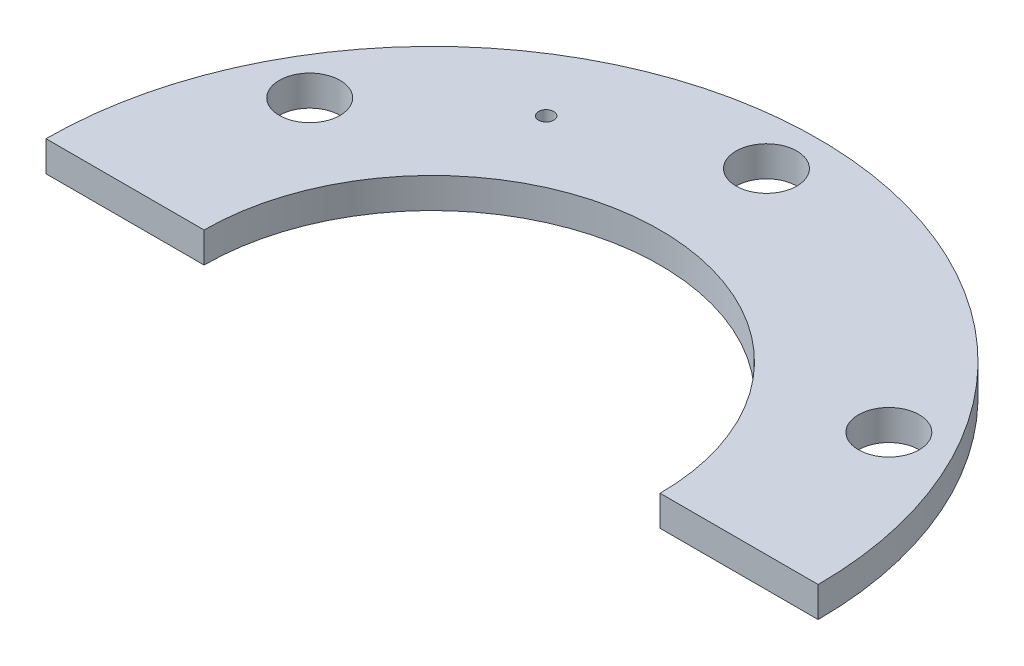
ISO-10303-21;
HEADER;
FILE_DESCRIPTION(('STEP AP214'),'2;1');
FILE_NAME('part.step','',(''),(''),'','','');
FILE_SCHEMA(('AUTOMOTIVE_DESIGN { 1 0 10303 214 1 1 1 1 }'));
ENDSEC;
DATA;
#1=APPLICATION_CONTEXT('core data for automotive mechanical design processes');
#2=APPLICATION_PROTOCOL_DEFINITION('international standard','automotive_design',2000,#1);
#3=PRODUCT_CONTEXT('',#1,'mechanical');
#4=PRODUCT('Part','Part','',(#3));
#5=PRODUCT_RELATED_PRODUCT_CATEGORY('part','',(#4));
#6=PRODUCT_DEFINITION_FORMATION('','',#4);
#7=PRODUCT_DEFINITION_CONTEXT('part definition',#1,'design');
#8=PRODUCT_DEFINITION('design','',#6,#7);
#9=PRODUCT_DEFINITION_SHAPE('','',#8);
#10=(LENGTH_UNIT() NAMED_UNIT(*) SI_UNIT(.MILLI.,.METRE.));
#11=(NAMED_UNIT(*) PLANE_ANGLE_UNIT() SI_UNIT($,.RADIAN.));
#12=(NAMED_UNIT(*) SI_UNIT($,.STERADIAN.) SOLID_ANGLE_UNIT());
#13=UNCERTAINTY_MEASURE_WITH_UNIT(LENGTH_MEASURE(1.E-05),#10,'distance_accuracy_value','');
#14=(GEOMETRIC_REPRESENTATION_CONTEXT(3) GLOBAL_UNCERTAINTY_ASSIGNED_CONTEXT((#13)) GLOBAL_UNIT_ASSIGNED_CONTEXT((#10,
#11,#12)) REPRESENTATION_CONTEXT('',''));
#15=CARTESIAN_POINT('',(0.,0.,0.));
#16=DIRECTION('',(0.,0.,1.));
#17=DIRECTION('',(1.,0.,0.));
#18=AXIS2_PLACEMENT_3D('',#15,#16,#17);
#19=CARTESIAN_POINT('',(0.,1.,0.));
#20=DIRECTION('',(0.,-1.,0.));
#21=DIRECTION('',(0.,0.,-1.));
#22=AXIS2_PLACEMENT_3D('',#19,#20,#21);
#23=CYLINDRICAL_SURFACE('',#22,12.7);
#24=DIRECTION('',(0.,-1.,0.));
#25=VECTOR('',#24,1.);
#26=CARTESIAN_POINT('',(-12.7,1.,0.));
#27=LINE('',#26,#25);
#28=CARTESIAN_POINT('',(-12.7,1.,0.));
#29=VERTEX_POINT('',#28);
#30=CARTESIAN_POINT('',(-12.7,0.,0.));
#31=VERTEX_POINT('',#30);
#32=EDGE_CURVE('E85',#29,#31,#27,.T.);
#33=ORIENTED_EDGE('',*,*,#32,.F.);
#34=CARTESIAN_POINT('',(0.,1.,0.));
#35=DIRECTION('',(0.,1.,0.));
#36=DIRECTION('',(0.,0.,1.));
#37=AXIS2_PLACEMENT_3D('',#34,#35,#36);
#38=CIRCLE('',#37,12.7);
#39=CARTESIAN_POINT('',(12.7,1.,0.));
#40=VERTEX_POINT('',#39);
#41=EDGE_CURVE('E78',#40,#29,#38,.T.);
#42=ORIENTED_EDGE('',*,*,#41,.F.);
#43=DIRECTION('',(0.,-1.,0.));
#44=VECTOR('',#43,1.);
#45=CARTESIAN_POINT('',(12.7,1.,0.));
#46=LINE('',#45,#44);
#47=CARTESIAN_POINT('',(12.7,0.,0.));
#48=VERTEX_POINT('',#47);
#49=EDGE_CURVE('E94',#48,#40,#46,.F.);
#50=ORIENTED_EDGE('',*,*,#49,.F.);
#51=CARTESIAN_POINT('',(0.,0.,0.));
#52=DIRECTION('',(0.,1.,0.));
#53=DIRECTION('',(0.,0.,1.));
#54=AXIS2_PLACEMENT_3D('',#51,#52,#53);
#55=CIRCLE('',#54,12.7);
#56=EDGE_CURVE('E112',#48,#31,#55,.T.);
#57=ORIENTED_EDGE('',*,*,#56,.T.);
#58=EDGE_LOOP('',(#33,#42,#50,#57));
#59=FACE_BOUND('',#58,.T.);
#60=ADVANCED_FACE('F34',(#59),#23,.T.);
#61=CARTESIAN_POINT('',(0.,1.,0.));
#62=DIRECTION('',(0.,1.,0.));
#63=DIRECTION('',(0.,0.,1.));
#64=AXIS2_PLACEMENT_3D('',#61,#62,#63);
#65=PLANE('',#64);
#66=CARTESIAN_POINT('',(-5.125,1.,-8.8767603887905));
#67=DIRECTION('',(0.,1.,0.));
#68=DIRECTION('',(0.,0.,1.));
#69=AXIS2_PLACEMENT_3D('',#66,#67,#68);
#70=CIRCLE('',#69,0.25);
#71=CARTESIAN_POINT('',(-5.125,1.,-8.6267603887905));
#72=VERTEX_POINT('',#71);
#73=EDGE_CURVE('E122',#72,#72,#70,.T.);
#74=ORIENTED_EDGE('',*,*,#73,.F.);
#75=EDGE_LOOP('',(#74));
#76=FACE_BOUND('',#75,.T.);
#77=CARTESIAN_POINT('',(-9.5262794416286,1.,-5.49999999999959));
#78=DIRECTION('',(0.,1.,0.));
#79=DIRECTION('',(0.,0.,1.));
#80=AXIS2_PLACEMENT_3D('',#77,#78,#79);
#81=CIRCLE('',#80,1.00000000000047);
#82=CARTESIAN_POINT('',(-9.5262794416286,1.,-4.49999999999912));
#83=VERTEX_POINT('',#82);
#84=EDGE_CURVE('E101',#83,#83,#81,.T.);
#85=ORIENTED_EDGE('',*,*,#84,.F.);
#86=EDGE_LOOP('',(#85));
#87=FACE_BOUND('',#86,.T.);
#88=CARTESIAN_POINT('',(9.52627944162914,1.,-5.50000000000035));
#89=DIRECTION('',(0.,1.,0.));
#90=DIRECTION('',(0.,0.,1.));
#91=AXIS2_PLACEMENT_3D('',#88,#89,#90);
#92=CIRCLE('',#91,1.00000000000019);
#93=CARTESIAN_POINT('',(9.52627944162914,1.,-4.50000000000015));
#94=VERTEX_POINT('',#93);
#95=EDGE_CURVE('E106',#94,#94,#92,.T.);
#96=ORIENTED_EDGE('',*,*,#95,.F.);
#97=EDGE_LOOP('',(#96));
#98=FACE_BOUND('',#97,.T.);
#99=CARTESIAN_POINT('',(0.,1.,-11.));
#100=DIRECTION('',(0.,1.,0.));
#101=DIRECTION('',(0.,0.,1.));
#102=AXIS2_PLACEMENT_3D('',#99,#100,#101);
#103=CIRCLE('',#102,1.);
#104=CARTESIAN_POINT('',(0.,1.,-10.));
#105=VERTEX_POINT('',#104);
#106=EDGE_CURVE('E109',#105,#105,#103,.T.);
#107=ORIENTED_EDGE('',*,*,#106,.F.);
#108=EDGE_LOOP('',(#107));
#109=FACE_BOUND('',#108,.T.);
#110=ORIENTED_EDGE('',*,*,#41,.T.);
#111=DIRECTION('',(1.,0.,0.));
#112=VECTOR('',#111,1.);
#113=CARTESIAN_POINT('',(0.,1.,0.));
#114=LINE('',#113,#112);
#115=CARTESIAN_POINT('',(-7.5,1.,0.));
#116=VERTEX_POINT('',#115);
#117=EDGE_CURVE('E72',#29,#116,#114,.T.);
#118=ORIENTED_EDGE('',*,*,#117,.T.);
#119=CARTESIAN_POINT('',(0.,1.,0.));
#120=DIRECTION('',(0.,1.,0.));
#121=DIRECTION('',(0.,0.,1.));
#122=AXIS2_PLACEMENT_3D('',#119,#120,#121);
#123=CIRCLE('',#122,7.5);
#124=CARTESIAN_POINT('',(7.5,1.,0.));
#125=VERTEX_POINT('',#124);
#126=EDGE_CURVE('E83',#125,#116,#123,.T.);
#127=ORIENTED_EDGE('',*,*,#126,.F.);
#128=EDGE_CURVE('E55',#125,#40,#114,.T.);
#129=ORIENTED_EDGE('',*,*,#128,.T.);
#130=EDGE_LOOP('',(#110,#118,#127,#129));
#131=FACE_BOUND('',#130,.T.);
#132=ADVANCED_FACE('F82',(#76,#87,#98,#109,#131),#65,.T.);
#133=CARTESIAN_POINT('',(0.,0.,0.));
#134=DIRECTION('',(0.,1.,0.));
#135=DIRECTION('',(0.,0.,1.));
#136=AXIS2_PLACEMENT_3D('',#133,#134,#135);
#137=PLANE('',#136);
#138=CARTESIAN_POINT('',(-5.125,0.,-8.8767603887905));
#139=DIRECTION('',(0.,1.,0.));
#140=DIRECTION('',(0.,0.,1.));
#141=AXIS2_PLACEMENT_3D('',#138,#139,#140);
#142=CIRCLE('',#141,0.25);
#143=CARTESIAN_POINT('',(-5.125,0.,-8.6267603887905));
#144=VERTEX_POINT('',#143);
#145=EDGE_CURVE('E125',#144,#144,#142,.T.);
#146=ORIENTED_EDGE('',*,*,#145,.T.);
#147=EDGE_LOOP('',(#146));
#148=FACE_BOUND('',#147,.T.);
#149=CARTESIAN_POINT('',(-9.5262794416286,0.,-5.49999999999959));
#150=DIRECTION('',(0.,1.,0.));
#151=DIRECTION('',(0.,0.,1.));
#152=AXIS2_PLACEMENT_3D('',#149,#150,#151);
#153=CIRCLE('',#152,1.00000000000047);
#154=CARTESIAN_POINT('',(-9.5262794416286,0.,-4.49999999999912));
#155=VERTEX_POINT('',#154);
#156=EDGE_CURVE('E92',#155,#155,#153,.T.);
#157=ORIENTED_EDGE('',*,*,#156,.T.);
#158=EDGE_LOOP('',(#157));
#159=FACE_BOUND('',#158,.T.);
#160=CARTESIAN_POINT('',(9.52627944162914,0.,-5.50000000000035));
#161=DIRECTION('',(0.,1.,0.));
#162=DIRECTION('',(0.,0.,1.));
#163=AXIS2_PLACEMENT_3D('',#160,#161,#162);
#164=CIRCLE('',#163,1.00000000000019);
#165=CARTESIAN_POINT('',(9.52627944162914,0.,-4.50000000000015));
#166=VERTEX_POINT('',#165);
#167=EDGE_CURVE('E88',#166,#166,#164,.T.);
#168=ORIENTED_EDGE('',*,*,#167,.T.);
#169=EDGE_LOOP('',(#168));
#170=FACE_BOUND('',#169,.T.);
#171=CARTESIAN_POINT('',(0.,0.,-11.));
#172=DIRECTION('',(0.,1.,0.));
#173=DIRECTION('',(0.,0.,1.));
#174=AXIS2_PLACEMENT_3D('',#171,#172,#173);
#175=CIRCLE('',#174,1.);
#176=CARTESIAN_POINT('',(0.,0.,-10.));
#177=VERTEX_POINT('',#176);
#178=EDGE_CURVE('E98',#177,#177,#175,.T.);
#179=ORIENTED_EDGE('',*,*,#178,.T.);
#180=EDGE_LOOP('',(#179));
#181=FACE_BOUND('',#180,.T.);
#182=DIRECTION('',(1.,0.,0.));
#183=VECTOR('',#182,1.);
#184=CARTESIAN_POINT('',(0.,0.,0.));
#185=LINE('',#184,#183);
#186=CARTESIAN_POINT('',(-7.5,0.,0.));
#187=VERTEX_POINT('',#186);
#188=EDGE_CURVE('E48',#31,#187,#185,.T.);
#189=ORIENTED_EDGE('',*,*,#188,.F.);
#190=ORIENTED_EDGE('',*,*,#56,.F.);
#191=CARTESIAN_POINT('',(7.5,0.,0.));
#192=VERTEX_POINT('',#191);
#193=EDGE_CURVE('E121',#192,#48,#185,.T.);
#194=ORIENTED_EDGE('',*,*,#193,.F.);
#195=CARTESIAN_POINT('',(0.,0.,0.));
#196=DIRECTION('',(0.,1.,0.));
#197=DIRECTION('',(0.,0.,1.));
#198=AXIS2_PLACEMENT_3D('',#195,#196,#197);
#199=CIRCLE('',#198,7.5);
#200=EDGE_CURVE('E89',#192,#187,#199,.T.);
#201=ORIENTED_EDGE('',*,*,#200,.T.);
#202=EDGE_LOOP('',(#189,#190,#194,#201));
#203=FACE_BOUND('',#202,.T.);
#204=ADVANCED_FACE('F120',(#148,#159,#170,#181,#203),#137,.F.);
#205=CARTESIAN_POINT('',(0.,0.,0.));
#206=DIRECTION('',(0.,1.,0.));
#207=DIRECTION('',(0.,0.,1.));
#208=AXIS2_PLACEMENT_3D('',#205,#206,#207);
#209=CYLINDRICAL_SURFACE('',#208,7.5);
#210=DIRECTION('',(0.,1.,0.));
#211=VECTOR('',#210,1.);
#212=CARTESIAN_POINT('',(7.5,0.,0.));
#213=LINE('',#212,#211);
#214=EDGE_CURVE('E11',#125,#192,#213,.F.);
#215=ORIENTED_EDGE('',*,*,#214,.F.);
#216=ORIENTED_EDGE('',*,*,#126,.T.);
#217=DIRECTION('',(0.,1.,0.));
#218=VECTOR('',#217,1.);
#219=CARTESIAN_POINT('',(-7.5,0.,0.));
#220=LINE('',#219,#218);
#221=EDGE_CURVE('E41',#187,#116,#220,.T.);
#222=ORIENTED_EDGE('',*,*,#221,.F.);
#223=ORIENTED_EDGE('',*,*,#200,.F.);
#224=EDGE_LOOP('',(#215,#216,#222,#223));
#225=FACE_BOUND('',#224,.T.);
#226=ADVANCED_FACE('F87',(#225),#209,.F.);
#227=CARTESIAN_POINT('',(-9.5262794416286,0.,-5.49999999999959));
#228=DIRECTION('',(0.,1.,0.));
#229=DIRECTION('',(0.,0.,1.));
#230=AXIS2_PLACEMENT_3D('',#227,#228,#229);
#231=CYLINDRICAL_SURFACE('',#230,1.00000000000047);
#232=ORIENTED_EDGE('',*,*,#84,.T.);
#233=EDGE_LOOP('',(#232));
#234=FACE_BOUND('',#233,.T.);
#235=ORIENTED_EDGE('',*,*,#156,.F.);
#236=EDGE_LOOP('',(#235));
#237=FACE_BOUND('',#236,.T.);
#238=ADVANCED_FACE('F156',(#234,#237),#231,.F.);
#239=CARTESIAN_POINT('',(9.52627944162914,0.,-5.50000000000035));
#240=DIRECTION('',(0.,1.,0.));
#241=DIRECTION('',(0.,0.,1.));
#242=AXIS2_PLACEMENT_3D('',#239,#240,#241);
#243=CYLINDRICAL_SURFACE('',#242,1.00000000000019);
#244=ORIENTED_EDGE('',*,*,#95,.T.);
#245=EDGE_LOOP('',(#244));
#246=FACE_BOUND('',#245,.T.);
#247=ORIENTED_EDGE('',*,*,#167,.F.);
#248=EDGE_LOOP('',(#247));
#249=FACE_BOUND('',#248,.T.);
#250=ADVANCED_FACE('F153',(#246,#249),#243,.F.);
#251=CARTESIAN_POINT('',(0.,0.,-11.));
#252=DIRECTION('',(0.,1.,0.));
#253=DIRECTION('',(0.,0.,1.));
#254=AXIS2_PLACEMENT_3D('',#251,#252,#253);
#255=CYLINDRICAL_SURFACE('',#254,1.);
#256=ORIENTED_EDGE('',*,*,#106,.T.);
#257=EDGE_LOOP('',(#256));
#258=FACE_BOUND('',#257,.T.);
#259=ORIENTED_EDGE('',*,*,#178,.F.);
#260=EDGE_LOOP('',(#259));
#261=FACE_BOUND('',#260,.T.);
#262=ADVANCED_FACE('F138',(#258,#261),#255,.F.);
#263=CARTESIAN_POINT('',(0.,0.,0.));
#264=DIRECTION('',(0.,0.,1.));
#265=DIRECTION('',(1.,0.,0.));
#266=AXIS2_PLACEMENT_3D('',#263,#264,#265);
#267=PLANE('',#266);
#268=ORIENTED_EDGE('',*,*,#32,.T.);
#269=ORIENTED_EDGE('',*,*,#188,.T.);
#270=ORIENTED_EDGE('',*,*,#221,.T.);
#271=ORIENTED_EDGE('',*,*,#117,.F.);
#272=EDGE_LOOP('',(#268,#269,#270,#271));
#273=FACE_BOUND('',#272,.T.);
#274=ADVANCED_FACE('F71',(#273),#267,.T.);
#275=ORIENTED_EDGE('',*,*,#49,.T.);
#276=ORIENTED_EDGE('',*,*,#128,.F.);
#277=ORIENTED_EDGE('',*,*,#214,.T.);
#278=ORIENTED_EDGE('',*,*,#193,.T.);
#279=EDGE_LOOP('',(#275,#276,#277,#278));
#280=FACE_BOUND('',#279,.T.);
#281=ADVANCED_FACE('F128',(#280),#267,.T.);
#282=CARTESIAN_POINT('',(-5.125,0.,-8.8767603887905));
#283=DIRECTION('',(0.,1.,0.));
#284=DIRECTION('',(0.,0.,1.));
#285=AXIS2_PLACEMENT_3D('',#282,#283,#284);
#286=CYLINDRICAL_SURFACE('',#285,0.25);
#287=ORIENTED_EDGE('',*,*,#73,.T.);
#288=EDGE_LOOP('',(#287));
#289=FACE_BOUND('',#288,.T.);
#290=ORIENTED_EDGE('',*,*,#145,.F.);
#291=EDGE_LOOP('',(#290));
#292=FACE_BOUND('',#291,.T.);
#293=ADVANCED_FACE('F130',(#289,#292),#286,.F.);
#294=CLOSED_SHELL('',(#60,#132,#204,#226,#238,#250,#262,#274,#281,#293));
#295=MANIFOLD_SOLID_BREP('B2',#294);
#296=ADVANCED_BREP_SHAPE_REPRESENTATION('',(#18,#295),#14);
#297=SHAPE_DEFINITION_REPRESENTATION(#9,#296);
ENDSEC;
END-ISO-10303-21;
